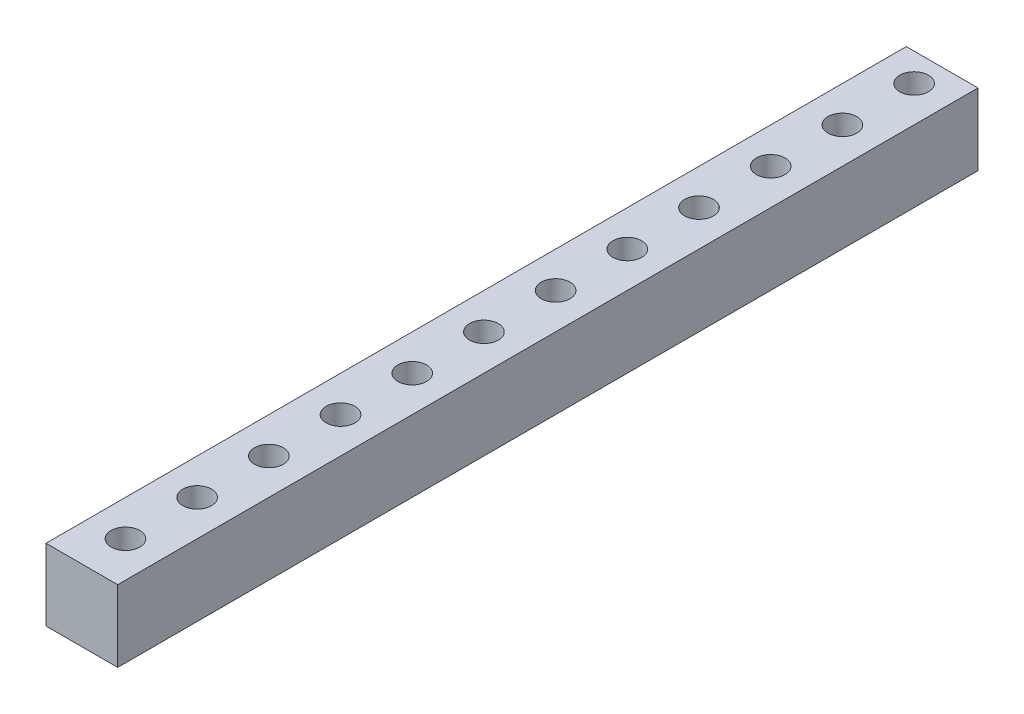
ISO-10303-21;
HEADER;
FILE_DESCRIPTION(('STEP AP214'),'2;1');
FILE_NAME('part.step','',(''),(''),'','','');
FILE_SCHEMA(('AUTOMOTIVE_DESIGN { 1 0 10303 214 1 1 1 1 }'));
ENDSEC;
DATA;
#1=APPLICATION_CONTEXT('core data for automotive mechanical design processes');
#2=APPLICATION_PROTOCOL_DEFINITION('international standard','automotive_design',2000,#1);
#3=PRODUCT_CONTEXT('',#1,'mechanical');
#4=PRODUCT('Part','Part','',(#3));
#5=PRODUCT_RELATED_PRODUCT_CATEGORY('part','',(#4));
#6=PRODUCT_DEFINITION_FORMATION('','',#4);
#7=PRODUCT_DEFINITION_CONTEXT('part definition',#1,'design');
#8=PRODUCT_DEFINITION('design','',#6,#7);
#9=PRODUCT_DEFINITION_SHAPE('','',#8);
#10=(LENGTH_UNIT() NAMED_UNIT(*) SI_UNIT(.MILLI.,.METRE.));
#11=(NAMED_UNIT(*) PLANE_ANGLE_UNIT() SI_UNIT($,.RADIAN.));
#12=(NAMED_UNIT(*) SI_UNIT($,.STERADIAN.) SOLID_ANGLE_UNIT());
#13=UNCERTAINTY_MEASURE_WITH_UNIT(LENGTH_MEASURE(1.E-05),#10,'distance_accuracy_value','');
#14=(GEOMETRIC_REPRESENTATION_CONTEXT(3) GLOBAL_UNCERTAINTY_ASSIGNED_CONTEXT((#13)) GLOBAL_UNIT_ASSIGNED_CONTEXT((#10,
#11,#12)) REPRESENTATION_CONTEXT('',''));
#15=CARTESIAN_POINT('',(0.,0.,0.));
#16=DIRECTION('',(0.,0.,1.));
#17=DIRECTION('',(1.,0.,0.));
#18=AXIS2_PLACEMENT_3D('',#15,#16,#17);
#19=CARTESIAN_POINT('',(1.27,1.27,-14.2448946306504));
#20=DIRECTION('',(0.,1.,0.));
#21=DIRECTION('',(0.,0.,1.));
#22=AXIS2_PLACEMENT_3D('',#19,#20,#21);
#23=CYLINDRICAL_SURFACE('',#22,0.509999999999994);
#24=CARTESIAN_POINT('',(1.27,-1.27,-14.2448946306504));
#25=DIRECTION('',(0.,1.,0.));
#26=DIRECTION('',(0.,0.,1.));
#27=AXIS2_PLACEMENT_3D('',#24,#25,#26);
#28=CIRCLE('',#27,0.51);
#29=CARTESIAN_POINT('',(1.27,-1.27,-13.7348946306504));
#30=VERTEX_POINT('',#29);
#31=EDGE_CURVE('E48',#30,#30,#28,.T.);
#32=ORIENTED_EDGE('',*,*,#31,.F.);
#33=EDGE_LOOP('',(#32));
#34=FACE_BOUND('',#33,.T.);
#35=CARTESIAN_POINT('',(1.27,1.27,-14.2448946306504));
#36=DIRECTION('',(0.,1.,0.));
#37=DIRECTION('',(0.,0.,1.));
#38=AXIS2_PLACEMENT_3D('',#35,#36,#37);
#39=CIRCLE('',#38,0.509999999999988);
#40=CARTESIAN_POINT('',(1.27,1.27,-13.7348946306504));
#41=VERTEX_POINT('',#40);
#42=EDGE_CURVE('E11',#41,#41,#39,.T.);
#43=ORIENTED_EDGE('',*,*,#42,.T.);
#44=EDGE_LOOP('',(#43));
#45=FACE_BOUND('',#44,.T.);
#46=ADVANCED_FACE('F39',(#34,#45),#23,.F.);
#47=CARTESIAN_POINT('',(1.27,1.27,-11.7048946306504));
#48=DIRECTION('',(0.,1.,0.));
#49=DIRECTION('',(0.,0.,1.));
#50=AXIS2_PLACEMENT_3D('',#47,#48,#49);
#51=CYLINDRICAL_SURFACE('',#50,0.509999999999994);
#52=CARTESIAN_POINT('',(1.27,-1.27,-11.7048946306504));
#53=DIRECTION('',(0.,1.,0.));
#54=DIRECTION('',(0.,0.,1.));
#55=AXIS2_PLACEMENT_3D('',#52,#53,#54);
#56=CIRCLE('',#55,0.51);
#57=CARTESIAN_POINT('',(1.27,-1.27,-11.1948946306504));
#58=VERTEX_POINT('',#57);
#59=EDGE_CURVE('E193',#58,#58,#56,.T.);
#60=ORIENTED_EDGE('',*,*,#59,.F.);
#61=EDGE_LOOP('',(#60));
#62=FACE_BOUND('',#61,.T.);
#63=CARTESIAN_POINT('',(1.27,1.27,-11.7048946306504));
#64=DIRECTION('',(0.,1.,0.));
#65=DIRECTION('',(0.,0.,1.));
#66=AXIS2_PLACEMENT_3D('',#63,#64,#65);
#67=CIRCLE('',#66,0.509999999999988);
#68=CARTESIAN_POINT('',(1.27,1.27,-11.1948946306504));
#69=VERTEX_POINT('',#68);
#70=EDGE_CURVE('E197',#69,#69,#67,.T.);
#71=ORIENTED_EDGE('',*,*,#70,.T.);
#72=EDGE_LOOP('',(#71));
#73=FACE_BOUND('',#72,.T.);
#74=ADVANCED_FACE('F208',(#62,#73),#51,.F.);
#75=CARTESIAN_POINT('',(1.27,1.27,-9.16489463065041));
#76=DIRECTION('',(0.,1.,0.));
#77=DIRECTION('',(0.,0.,1.));
#78=AXIS2_PLACEMENT_3D('',#75,#76,#77);
#79=CYLINDRICAL_SURFACE('',#78,0.509999999999994);
#80=CARTESIAN_POINT('',(1.27,-1.27,-9.16489463065041));
#81=DIRECTION('',(0.,1.,0.));
#82=DIRECTION('',(0.,0.,1.));
#83=AXIS2_PLACEMENT_3D('',#80,#81,#82);
#84=CIRCLE('',#83,0.51);
#85=CARTESIAN_POINT('',(1.27,-1.27,-8.65489463065041));
#86=VERTEX_POINT('',#85);
#87=EDGE_CURVE('E185',#86,#86,#84,.T.);
#88=ORIENTED_EDGE('',*,*,#87,.F.);
#89=EDGE_LOOP('',(#88));
#90=FACE_BOUND('',#89,.T.);
#91=CARTESIAN_POINT('',(1.27,1.27,-9.16489463065041));
#92=DIRECTION('',(0.,1.,0.));
#93=DIRECTION('',(0.,0.,1.));
#94=AXIS2_PLACEMENT_3D('',#91,#92,#93);
#95=CIRCLE('',#94,0.509999999999988);
#96=CARTESIAN_POINT('',(1.27,1.27,-8.65489463065043));
#97=VERTEX_POINT('',#96);
#98=EDGE_CURVE('E189',#97,#97,#95,.T.);
#99=ORIENTED_EDGE('',*,*,#98,.T.);
#100=EDGE_LOOP('',(#99));
#101=FACE_BOUND('',#100,.T.);
#102=ADVANCED_FACE('F253',(#90,#101),#79,.F.);
#103=CARTESIAN_POINT('',(1.27,1.27,-6.62489463065041));
#104=DIRECTION('',(0.,1.,0.));
#105=DIRECTION('',(0.,0.,1.));
#106=AXIS2_PLACEMENT_3D('',#103,#104,#105);
#107=CYLINDRICAL_SURFACE('',#106,0.509999999999994);
#108=CARTESIAN_POINT('',(1.27,-1.27,-6.62489463065041));
#109=DIRECTION('',(0.,1.,0.));
#110=DIRECTION('',(0.,0.,1.));
#111=AXIS2_PLACEMENT_3D('',#108,#109,#110);
#112=CIRCLE('',#111,0.51);
#113=CARTESIAN_POINT('',(1.27,-1.27,-6.11489463065041));
#114=VERTEX_POINT('',#113);
#115=EDGE_CURVE('E177',#114,#114,#112,.T.);
#116=ORIENTED_EDGE('',*,*,#115,.F.);
#117=EDGE_LOOP('',(#116));
#118=FACE_BOUND('',#117,.T.);
#119=CARTESIAN_POINT('',(1.27,1.27,-6.62489463065041));
#120=DIRECTION('',(0.,1.,0.));
#121=DIRECTION('',(0.,0.,1.));
#122=AXIS2_PLACEMENT_3D('',#119,#120,#121);
#123=CIRCLE('',#122,0.509999999999988);
#124=CARTESIAN_POINT('',(1.27,1.27,-6.11489463065042));
#125=VERTEX_POINT('',#124);
#126=EDGE_CURVE('E181',#125,#125,#123,.T.);
#127=ORIENTED_EDGE('',*,*,#126,.T.);
#128=EDGE_LOOP('',(#127));
#129=FACE_BOUND('',#128,.T.);
#130=ADVANCED_FACE('F249',(#118,#129),#107,.F.);
#131=CARTESIAN_POINT('',(1.27,1.27,-4.08489463065041));
#132=DIRECTION('',(0.,1.,0.));
#133=DIRECTION('',(0.,0.,1.));
#134=AXIS2_PLACEMENT_3D('',#131,#132,#133);
#135=CYLINDRICAL_SURFACE('',#134,0.509999999999994);
#136=CARTESIAN_POINT('',(1.27,-1.27,-4.08489463065041));
#137=DIRECTION('',(0.,1.,0.));
#138=DIRECTION('',(0.,0.,1.));
#139=AXIS2_PLACEMENT_3D('',#136,#137,#138);
#140=CIRCLE('',#139,0.51);
#141=CARTESIAN_POINT('',(1.27,-1.27,-3.57489463065041));
#142=VERTEX_POINT('',#141);
#143=EDGE_CURVE('E169',#142,#142,#140,.T.);
#144=ORIENTED_EDGE('',*,*,#143,.F.);
#145=EDGE_LOOP('',(#144));
#146=FACE_BOUND('',#145,.T.);
#147=CARTESIAN_POINT('',(1.27,1.27,-4.08489463065041));
#148=DIRECTION('',(0.,1.,0.));
#149=DIRECTION('',(0.,0.,1.));
#150=AXIS2_PLACEMENT_3D('',#147,#148,#149);
#151=CIRCLE('',#150,0.509999999999988);
#152=CARTESIAN_POINT('',(1.27,1.27,-3.57489463065042));
#153=VERTEX_POINT('',#152);
#154=EDGE_CURVE('E173',#153,#153,#151,.T.);
#155=ORIENTED_EDGE('',*,*,#154,.T.);
#156=EDGE_LOOP('',(#155));
#157=FACE_BOUND('',#156,.T.);
#158=ADVANCED_FACE('F245',(#146,#157),#135,.F.);
#159=CARTESIAN_POINT('',(1.27,1.27,-1.54489463065041));
#160=DIRECTION('',(0.,1.,0.));
#161=DIRECTION('',(0.,0.,1.));
#162=AXIS2_PLACEMENT_3D('',#159,#160,#161);
#163=CYLINDRICAL_SURFACE('',#162,0.509999999999994);
#164=CARTESIAN_POINT('',(1.27,-1.27,-1.54489463065041));
#165=DIRECTION('',(0.,1.,0.));
#166=DIRECTION('',(0.,0.,1.));
#167=AXIS2_PLACEMENT_3D('',#164,#165,#166);
#168=CIRCLE('',#167,0.51);
#169=CARTESIAN_POINT('',(1.27,-1.27,-1.03489463065041));
#170=VERTEX_POINT('',#169);
#171=EDGE_CURVE('E161',#170,#170,#168,.T.);
#172=ORIENTED_EDGE('',*,*,#171,.F.);
#173=EDGE_LOOP('',(#172));
#174=FACE_BOUND('',#173,.T.);
#175=CARTESIAN_POINT('',(1.27,1.27,-1.54489463065041));
#176=DIRECTION('',(0.,1.,0.));
#177=DIRECTION('',(0.,0.,1.));
#178=AXIS2_PLACEMENT_3D('',#175,#176,#177);
#179=CIRCLE('',#178,0.509999999999988);
#180=CARTESIAN_POINT('',(1.27,1.27,-1.03489463065042));
#181=VERTEX_POINT('',#180);
#182=EDGE_CURVE('E165',#181,#181,#179,.T.);
#183=ORIENTED_EDGE('',*,*,#182,.T.);
#184=EDGE_LOOP('',(#183));
#185=FACE_BOUND('',#184,.T.);
#186=ADVANCED_FACE('F241',(#174,#185),#163,.F.);
#187=CARTESIAN_POINT('',(1.27,1.27,0.995105369349587));
#188=DIRECTION('',(0.,1.,0.));
#189=DIRECTION('',(0.,0.,1.));
#190=AXIS2_PLACEMENT_3D('',#187,#188,#189);
#191=CYLINDRICAL_SURFACE('',#190,0.509999999999994);
#192=CARTESIAN_POINT('',(1.27,-1.27,0.995105369349587));
#193=DIRECTION('',(0.,1.,0.));
#194=DIRECTION('',(0.,0.,1.));
#195=AXIS2_PLACEMENT_3D('',#192,#193,#194);
#196=CIRCLE('',#195,0.51);
#197=CARTESIAN_POINT('',(1.27,-1.27,1.50510536934959));
#198=VERTEX_POINT('',#197);
#199=EDGE_CURVE('E153',#198,#198,#196,.T.);
#200=ORIENTED_EDGE('',*,*,#199,.F.);
#201=EDGE_LOOP('',(#200));
#202=FACE_BOUND('',#201,.T.);
#203=CARTESIAN_POINT('',(1.27,1.27,0.995105369349587));
#204=DIRECTION('',(0.,1.,0.));
#205=DIRECTION('',(0.,0.,1.));
#206=AXIS2_PLACEMENT_3D('',#203,#204,#205);
#207=CIRCLE('',#206,0.509999999999988);
#208=CARTESIAN_POINT('',(1.27,1.27,1.50510536934957));
#209=VERTEX_POINT('',#208);
#210=EDGE_CURVE('E157',#209,#209,#207,.T.);
#211=ORIENTED_EDGE('',*,*,#210,.T.);
#212=EDGE_LOOP('',(#211));
#213=FACE_BOUND('',#212,.T.);
#214=ADVANCED_FACE('F237',(#202,#213),#191,.F.);
#215=CARTESIAN_POINT('',(1.27,1.27,3.53510536934959));
#216=DIRECTION('',(0.,1.,0.));
#217=DIRECTION('',(0.,0.,1.));
#218=AXIS2_PLACEMENT_3D('',#215,#216,#217);
#219=CYLINDRICAL_SURFACE('',#218,0.509999999999994);
#220=CARTESIAN_POINT('',(1.27,-1.27,3.53510536934959));
#221=DIRECTION('',(0.,1.,0.));
#222=DIRECTION('',(0.,0.,1.));
#223=AXIS2_PLACEMENT_3D('',#220,#221,#222);
#224=CIRCLE('',#223,0.51);
#225=CARTESIAN_POINT('',(1.27,-1.27,4.04510536934959));
#226=VERTEX_POINT('',#225);
#227=EDGE_CURVE('E145',#226,#226,#224,.T.);
#228=ORIENTED_EDGE('',*,*,#227,.F.);
#229=EDGE_LOOP('',(#228));
#230=FACE_BOUND('',#229,.T.);
#231=CARTESIAN_POINT('',(1.27,1.27,3.53510536934959));
#232=DIRECTION('',(0.,1.,0.));
#233=DIRECTION('',(0.,0.,1.));
#234=AXIS2_PLACEMENT_3D('',#231,#232,#233);
#235=CIRCLE('',#234,0.509999999999988);
#236=CARTESIAN_POINT('',(1.27,1.27,4.04510536934958));
#237=VERTEX_POINT('',#236);
#238=EDGE_CURVE('E149',#237,#237,#235,.T.);
#239=ORIENTED_EDGE('',*,*,#238,.T.);
#240=EDGE_LOOP('',(#239));
#241=FACE_BOUND('',#240,.T.);
#242=ADVANCED_FACE('F233',(#230,#241),#219,.F.);
#243=CARTESIAN_POINT('',(1.27,1.27,6.07510536934959));
#244=DIRECTION('',(0.,1.,0.));
#245=DIRECTION('',(0.,0.,1.));
#246=AXIS2_PLACEMENT_3D('',#243,#244,#245);
#247=CYLINDRICAL_SURFACE('',#246,0.509999999999994);
#248=CARTESIAN_POINT('',(1.27,-1.27,6.07510536934959));
#249=DIRECTION('',(0.,1.,0.));
#250=DIRECTION('',(0.,0.,1.));
#251=AXIS2_PLACEMENT_3D('',#248,#249,#250);
#252=CIRCLE('',#251,0.51);
#253=CARTESIAN_POINT('',(1.27,-1.27,6.58510536934959));
#254=VERTEX_POINT('',#253);
#255=EDGE_CURVE('E137',#254,#254,#252,.T.);
#256=ORIENTED_EDGE('',*,*,#255,.F.);
#257=EDGE_LOOP('',(#256));
#258=FACE_BOUND('',#257,.T.);
#259=CARTESIAN_POINT('',(1.27,1.27,6.07510536934959));
#260=DIRECTION('',(0.,1.,0.));
#261=DIRECTION('',(0.,0.,1.));
#262=AXIS2_PLACEMENT_3D('',#259,#260,#261);
#263=CIRCLE('',#262,0.509999999999988);
#264=CARTESIAN_POINT('',(1.27,1.27,6.58510536934958));
#265=VERTEX_POINT('',#264);
#266=EDGE_CURVE('E141',#265,#265,#263,.T.);
#267=ORIENTED_EDGE('',*,*,#266,.T.);
#268=EDGE_LOOP('',(#267));
#269=FACE_BOUND('',#268,.T.);
#270=ADVANCED_FACE('F229',(#258,#269),#247,.F.);
#271=CARTESIAN_POINT('',(1.27,1.27,8.61510536934959));
#272=DIRECTION('',(0.,1.,0.));
#273=DIRECTION('',(0.,0.,1.));
#274=AXIS2_PLACEMENT_3D('',#271,#272,#273);
#275=CYLINDRICAL_SURFACE('',#274,0.509999999999994);
#276=CARTESIAN_POINT('',(1.27,-1.27,8.61510536934959));
#277=DIRECTION('',(0.,1.,0.));
#278=DIRECTION('',(0.,0.,1.));
#279=AXIS2_PLACEMENT_3D('',#276,#277,#278);
#280=CIRCLE('',#279,0.51);
#281=CARTESIAN_POINT('',(1.27,-1.27,9.12510536934959));
#282=VERTEX_POINT('',#281);
#283=EDGE_CURVE('E129',#282,#282,#280,.T.);
#284=ORIENTED_EDGE('',*,*,#283,.F.);
#285=EDGE_LOOP('',(#284));
#286=FACE_BOUND('',#285,.T.);
#287=CARTESIAN_POINT('',(1.27,1.27,8.61510536934959));
#288=DIRECTION('',(0.,1.,0.));
#289=DIRECTION('',(0.,0.,1.));
#290=AXIS2_PLACEMENT_3D('',#287,#288,#289);
#291=CIRCLE('',#290,0.509999999999988);
#292=CARTESIAN_POINT('',(1.27,1.27,9.12510536934957));
#293=VERTEX_POINT('',#292);
#294=EDGE_CURVE('E133',#293,#293,#291,.T.);
#295=ORIENTED_EDGE('',*,*,#294,.T.);
#296=EDGE_LOOP('',(#295));
#297=FACE_BOUND('',#296,.T.);
#298=ADVANCED_FACE('F220',(#286,#297),#275,.F.);
#299=CARTESIAN_POINT('',(2.54,-1.27,-15.24));
#300=DIRECTION('',(0.,0.,1.));
#301=DIRECTION('',(1.,0.,0.));
#302=AXIS2_PLACEMENT_3D('',#299,#300,#301);
#303=PLANE('',#302);
#304=DIRECTION('',(0.,1.,0.));
#305=VECTOR('',#304,1.);
#306=CARTESIAN_POINT('',(0.,-1.27,-15.24));
#307=LINE('',#306,#305);
#308=CARTESIAN_POINT('',(0.,-1.27,-15.24));
#309=VERTEX_POINT('',#308);
#310=CARTESIAN_POINT('',(0.,1.27,-15.24));
#311=VERTEX_POINT('',#310);
#312=EDGE_CURVE('E112',#309,#311,#307,.T.);
#313=ORIENTED_EDGE('',*,*,#312,.T.);
#314=DIRECTION('',(-1.,0.,0.));
#315=VECTOR('',#314,1.);
#316=CARTESIAN_POINT('',(2.54,1.27,-15.24));
#317=LINE('',#316,#315);
#318=CARTESIAN_POINT('',(2.54,1.27,-15.24));
#319=VERTEX_POINT('',#318);
#320=EDGE_CURVE('E101',#319,#311,#317,.T.);
#321=ORIENTED_EDGE('',*,*,#320,.F.);
#322=DIRECTION('',(0.,1.,0.));
#323=VECTOR('',#322,1.);
#324=CARTESIAN_POINT('',(2.54,-1.27,-15.24));
#325=LINE('',#324,#323);
#326=CARTESIAN_POINT('',(2.54,-1.27,-15.24));
#327=VERTEX_POINT('',#326);
#328=EDGE_CURVE('E92',#327,#319,#325,.T.);
#329=ORIENTED_EDGE('',*,*,#328,.F.);
#330=DIRECTION('',(-1.,0.,0.));
#331=VECTOR('',#330,1.);
#332=CARTESIAN_POINT('',(2.54,-1.27,-15.24));
#333=LINE('',#332,#331);
#334=EDGE_CURVE('E108',#327,#309,#333,.T.);
#335=ORIENTED_EDGE('',*,*,#334,.T.);
#336=EDGE_LOOP('',(#313,#321,#329,#335));
#337=FACE_BOUND('',#336,.T.);
#338=ADVANCED_FACE('F212',(#337),#303,.F.);
#339=CARTESIAN_POINT('',(2.54,1.27,15.24));
#340=DIRECTION('',(0.,-1.,0.));
#341=DIRECTION('',(0.,0.,-1.));
#342=AXIS2_PLACEMENT_3D('',#339,#340,#341);
#343=PLANE('',#342);
#344=CARTESIAN_POINT('',(1.27,1.27,11.1551053693496));
#345=DIRECTION('',(0.,1.,0.));
#346=DIRECTION('',(0.,0.,1.));
#347=AXIS2_PLACEMENT_3D('',#344,#345,#346);
#348=CIRCLE('',#347,0.509999999999988);
#349=CARTESIAN_POINT('',(1.27,1.27,11.6651053693496));
#350=VERTEX_POINT('',#349);
#351=EDGE_CURVE('E292',#350,#350,#348,.T.);
#352=ORIENTED_EDGE('',*,*,#351,.F.);
#353=EDGE_LOOP('',(#352));
#354=FACE_BOUND('',#353,.T.);
#355=CARTESIAN_POINT('',(1.27,1.27,13.6951053693496));
#356=DIRECTION('',(0.,1.,0.));
#357=DIRECTION('',(0.,0.,1.));
#358=AXIS2_PLACEMENT_3D('',#355,#356,#357);
#359=CIRCLE('',#358,0.509999999999988);
#360=CARTESIAN_POINT('',(1.27,1.27,14.2051053693496));
#361=VERTEX_POINT('',#360);
#362=EDGE_CURVE('E294',#361,#361,#359,.T.);
#363=ORIENTED_EDGE('',*,*,#362,.F.);
#364=EDGE_LOOP('',(#363));
#365=FACE_BOUND('',#364,.T.);
#366=DIRECTION('',(0.,0.,1.));
#367=VECTOR('',#366,1.);
#368=CARTESIAN_POINT('',(0.,1.27,15.24));
#369=LINE('',#368,#367);
#370=CARTESIAN_POINT('',(0.,1.27,15.24));
#371=VERTEX_POINT('',#370);
#372=EDGE_CURVE('E99',#311,#371,#369,.T.);
#373=ORIENTED_EDGE('',*,*,#372,.T.);
#374=DIRECTION('',(-1.,0.,0.));
#375=VECTOR('',#374,1.);
#376=CARTESIAN_POINT('',(2.54,1.27,15.24));
#377=LINE('',#376,#375);
#378=CARTESIAN_POINT('',(2.54,1.27,15.24));
#379=VERTEX_POINT('',#378);
#380=EDGE_CURVE('E96',#379,#371,#377,.T.);
#381=ORIENTED_EDGE('',*,*,#380,.F.);
#382=DIRECTION('',(0.,0.,1.));
#383=VECTOR('',#382,1.);
#384=CARTESIAN_POINT('',(2.54,1.27,15.24));
#385=LINE('',#384,#383);
#386=EDGE_CURVE('E87',#319,#379,#385,.T.);
#387=ORIENTED_EDGE('',*,*,#386,.F.);
#388=ORIENTED_EDGE('',*,*,#320,.T.);
#389=EDGE_LOOP('',(#373,#381,#387,#388));
#390=FACE_BOUND('',#389,.T.);
#391=ORIENTED_EDGE('',*,*,#294,.F.);
#392=EDGE_LOOP('',(#391));
#393=FACE_BOUND('',#392,.T.);
#394=ORIENTED_EDGE('',*,*,#266,.F.);
#395=EDGE_LOOP('',(#394));
#396=FACE_BOUND('',#395,.T.);
#397=ORIENTED_EDGE('',*,*,#238,.F.);
#398=EDGE_LOOP('',(#397));
#399=FACE_BOUND('',#398,.T.);
#400=ORIENTED_EDGE('',*,*,#210,.F.);
#401=EDGE_LOOP('',(#400));
#402=FACE_BOUND('',#401,.T.);
#403=ORIENTED_EDGE('',*,*,#182,.F.);
#404=EDGE_LOOP('',(#403));
#405=FACE_BOUND('',#404,.T.);
#406=ORIENTED_EDGE('',*,*,#154,.F.);
#407=EDGE_LOOP('',(#406));
#408=FACE_BOUND('',#407,.T.);
#409=ORIENTED_EDGE('',*,*,#126,.F.);
#410=EDGE_LOOP('',(#409));
#411=FACE_BOUND('',#410,.T.);
#412=ORIENTED_EDGE('',*,*,#98,.F.);
#413=EDGE_LOOP('',(#412));
#414=FACE_BOUND('',#413,.T.);
#415=ORIENTED_EDGE('',*,*,#70,.F.);
#416=EDGE_LOOP('',(#415));
#417=FACE_BOUND('',#416,.T.);
#418=ORIENTED_EDGE('',*,*,#42,.F.);
#419=EDGE_LOOP('',(#418));
#420=FACE_BOUND('',#419,.T.);
#421=ADVANCED_FACE('F97',(#354,#365,#390,#393,#396,#399,#402,#405,#408,#411,#414,#417,#420),
#343,.F.);
#422=CARTESIAN_POINT('',(2.54,-1.27,15.24));
#423=DIRECTION('',(0.,0.,-1.));
#424=DIRECTION('',(-1.,0.,0.));
#425=AXIS2_PLACEMENT_3D('',#422,#423,#424);
#426=PLANE('',#425);
#427=DIRECTION('',(0.,-1.,0.));
#428=VECTOR('',#427,1.);
#429=CARTESIAN_POINT('',(0.,-1.27,15.24));
#430=LINE('',#429,#428);
#431=CARTESIAN_POINT('',(0.,-1.27,15.24));
#432=VERTEX_POINT('',#431);
#433=EDGE_CURVE('E73',#371,#432,#430,.T.);
#434=ORIENTED_EDGE('',*,*,#433,.T.);
#435=DIRECTION('',(-1.,0.,0.));
#436=VECTOR('',#435,1.);
#437=CARTESIAN_POINT('',(2.54,-1.27,15.24));
#438=LINE('',#437,#436);
#439=CARTESIAN_POINT('',(2.54,-1.27,15.24));
#440=VERTEX_POINT('',#439);
#441=EDGE_CURVE('E102',#440,#432,#438,.T.);
#442=ORIENTED_EDGE('',*,*,#441,.F.);
#443=DIRECTION('',(0.,-1.,0.));
#444=VECTOR('',#443,1.);
#445=CARTESIAN_POINT('',(2.54,-1.27,15.24));
#446=LINE('',#445,#444);
#447=EDGE_CURVE('E90',#379,#440,#446,.T.);
#448=ORIENTED_EDGE('',*,*,#447,.F.);
#449=ORIENTED_EDGE('',*,*,#380,.T.);
#450=EDGE_LOOP('',(#434,#442,#448,#449));
#451=FACE_BOUND('',#450,.T.);
#452=ADVANCED_FACE('F104',(#451),#426,.F.);
#453=CARTESIAN_POINT('',(2.54,-1.27,15.24));
#454=DIRECTION('',(0.,1.,0.));
#455=DIRECTION('',(0.,0.,1.));
#456=AXIS2_PLACEMENT_3D('',#453,#454,#455);
#457=PLANE('',#456);
#458=CARTESIAN_POINT('',(1.27,-1.27,11.1551053693496));
#459=DIRECTION('',(0.,1.,0.));
#460=DIRECTION('',(0.,0.,1.));
#461=AXIS2_PLACEMENT_3D('',#458,#459,#460);
#462=CIRCLE('',#461,0.51);
#463=CARTESIAN_POINT('',(1.27,-1.27,11.6651053693496));
#464=VERTEX_POINT('',#463);
#465=EDGE_CURVE('E290',#464,#464,#462,.T.);
#466=ORIENTED_EDGE('',*,*,#465,.T.);
#467=EDGE_LOOP('',(#466));
#468=FACE_BOUND('',#467,.T.);
#469=CARTESIAN_POINT('',(1.27,-1.27,13.6951053693496));
#470=DIRECTION('',(0.,1.,0.));
#471=DIRECTION('',(0.,0.,1.));
#472=AXIS2_PLACEMENT_3D('',#469,#470,#471);
#473=CIRCLE('',#472,0.51);
#474=CARTESIAN_POINT('',(1.27,-1.27,14.2051053693496));
#475=VERTEX_POINT('',#474);
#476=EDGE_CURVE('E116',#475,#475,#473,.T.);
#477=ORIENTED_EDGE('',*,*,#476,.T.);
#478=EDGE_LOOP('',(#477));
#479=FACE_BOUND('',#478,.T.);
#480=DIRECTION('',(0.,0.,-1.));
#481=VECTOR('',#480,1.);
#482=CARTESIAN_POINT('',(0.,-1.27,15.24));
#483=LINE('',#482,#481);
#484=EDGE_CURVE('E79',#432,#309,#483,.T.);
#485=ORIENTED_EDGE('',*,*,#484,.T.);
#486=ORIENTED_EDGE('',*,*,#334,.F.);
#487=DIRECTION('',(0.,0.,-1.));
#488=VECTOR('',#487,1.);
#489=CARTESIAN_POINT('',(2.54,-1.27,15.24));
#490=LINE('',#489,#488);
#491=EDGE_CURVE('E56',#440,#327,#490,.T.);
#492=ORIENTED_EDGE('',*,*,#491,.F.);
#493=ORIENTED_EDGE('',*,*,#441,.T.);
#494=EDGE_LOOP('',(#485,#486,#492,#493));
#495=FACE_BOUND('',#494,.T.);
#496=ORIENTED_EDGE('',*,*,#283,.T.);
#497=EDGE_LOOP('',(#496));
#498=FACE_BOUND('',#497,.T.);
#499=ORIENTED_EDGE('',*,*,#255,.T.);
#500=EDGE_LOOP('',(#499));
#501=FACE_BOUND('',#500,.T.);
#502=ORIENTED_EDGE('',*,*,#227,.T.);
#503=EDGE_LOOP('',(#502));
#504=FACE_BOUND('',#503,.T.);
#505=ORIENTED_EDGE('',*,*,#199,.T.);
#506=EDGE_LOOP('',(#505));
#507=FACE_BOUND('',#506,.T.);
#508=ORIENTED_EDGE('',*,*,#171,.T.);
#509=EDGE_LOOP('',(#508));
#510=FACE_BOUND('',#509,.T.);
#511=ORIENTED_EDGE('',*,*,#143,.T.);
#512=EDGE_LOOP('',(#511));
#513=FACE_BOUND('',#512,.T.);
#514=ORIENTED_EDGE('',*,*,#115,.T.);
#515=EDGE_LOOP('',(#514));
#516=FACE_BOUND('',#515,.T.);
#517=ORIENTED_EDGE('',*,*,#87,.T.);
#518=EDGE_LOOP('',(#517));
#519=FACE_BOUND('',#518,.T.);
#520=ORIENTED_EDGE('',*,*,#59,.T.);
#521=EDGE_LOOP('',(#520));
#522=FACE_BOUND('',#521,.T.);
#523=ORIENTED_EDGE('',*,*,#31,.T.);
#524=EDGE_LOOP('',(#523));
#525=FACE_BOUND('',#524,.T.);
#526=ADVANCED_FACE('F204',(#468,#479,#495,#498,#501,#504,#507,#510,#513,#516,#519,#522,#525),
#457,.F.);
#527=CARTESIAN_POINT('',(2.54,0.,0.));
#528=DIRECTION('',(-1.,0.,0.));
#529=DIRECTION('',(0.,0.,1.));
#530=AXIS2_PLACEMENT_3D('',#527,#528,#529);
#531=PLANE('',#530);
#532=ORIENTED_EDGE('',*,*,#328,.T.);
#533=ORIENTED_EDGE('',*,*,#386,.T.);
#534=ORIENTED_EDGE('',*,*,#447,.T.);
#535=ORIENTED_EDGE('',*,*,#491,.T.);
#536=EDGE_LOOP('',(#532,#533,#534,#535));
#537=FACE_BOUND('',#536,.T.);
#538=ADVANCED_FACE('F88',(#537),#531,.F.);
#539=CARTESIAN_POINT('',(0.,0.,0.));
#540=DIRECTION('',(-1.,0.,0.));
#541=DIRECTION('',(0.,0.,1.));
#542=AXIS2_PLACEMENT_3D('',#539,#540,#541);
#543=PLANE('',#542);
#544=ORIENTED_EDGE('',*,*,#312,.F.);
#545=ORIENTED_EDGE('',*,*,#484,.F.);
#546=ORIENTED_EDGE('',*,*,#433,.F.);
#547=ORIENTED_EDGE('',*,*,#372,.F.);
#548=EDGE_LOOP('',(#544,#545,#546,#547));
#549=FACE_BOUND('',#548,.T.);
#550=ADVANCED_FACE('F271',(#549),#543,.T.);
#551=CARTESIAN_POINT('',(1.27,1.27,13.6951053693496));
#552=DIRECTION('',(0.,1.,0.));
#553=DIRECTION('',(0.,0.,1.));
#554=AXIS2_PLACEMENT_3D('',#551,#552,#553);
#555=CYLINDRICAL_SURFACE('',#554,0.509999999999994);
#556=ORIENTED_EDGE('',*,*,#476,.F.);
#557=EDGE_LOOP('',(#556));
#558=FACE_BOUND('',#557,.T.);
#559=ORIENTED_EDGE('',*,*,#362,.T.);
#560=EDGE_LOOP('',(#559));
#561=FACE_BOUND('',#560,.T.);
#562=ADVANCED_FACE('F277',(#558,#561),#555,.F.);
#563=CARTESIAN_POINT('',(1.27,1.27,11.1551053693496));
#564=DIRECTION('',(0.,1.,0.));
#565=DIRECTION('',(0.,0.,1.));
#566=AXIS2_PLACEMENT_3D('',#563,#564,#565);
#567=CYLINDRICAL_SURFACE('',#566,0.509999999999994);
#568=ORIENTED_EDGE('',*,*,#465,.F.);
#569=EDGE_LOOP('',(#568));
#570=FACE_BOUND('',#569,.T.);
#571=ORIENTED_EDGE('',*,*,#351,.T.);
#572=EDGE_LOOP('',(#571));
#573=FACE_BOUND('',#572,.T.);
#574=ADVANCED_FACE('F282',(#570,#573),#567,.F.);
#575=CLOSED_SHELL('',(#46,#74,#102,#130,#158,#186,#214,#242,#270,#298,#338,#421,#452,#526,#538,
#550,#562,#574));
#576=MANIFOLD_SOLID_BREP('B2',#575);
#577=ADVANCED_BREP_SHAPE_REPRESENTATION('',(#18,#576),#14);
#578=SHAPE_DEFINITION_REPRESENTATION(#9,#577);
ENDSEC;
END-ISO-10303-21;
